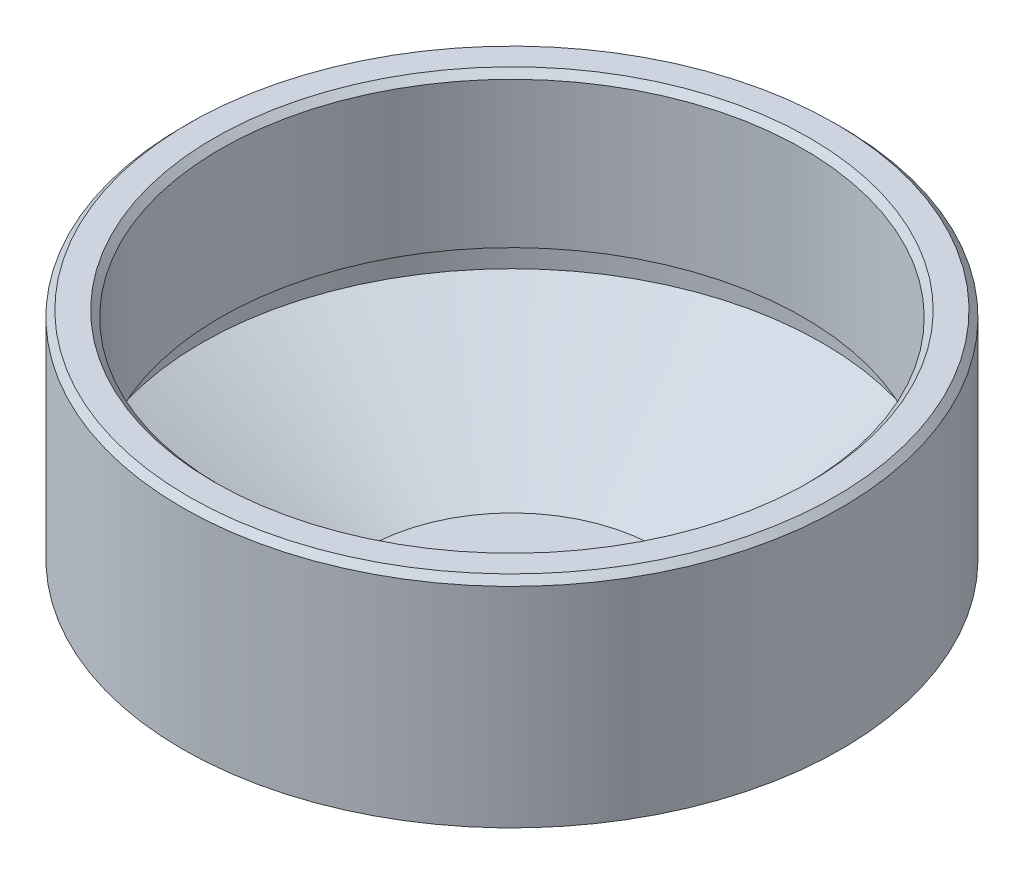
ISO-10303-21;
HEADER;
FILE_DESCRIPTION(('STEP AP214'),'2;1');
FILE_NAME('part.step','',(''),(''),'','','');
FILE_SCHEMA(('AUTOMOTIVE_DESIGN { 1 0 10303 214 1 1 1 1 }'));
ENDSEC;
DATA;
#1=APPLICATION_CONTEXT('core data for automotive mechanical design processes');
#2=APPLICATION_PROTOCOL_DEFINITION('international standard','automotive_design',2000,#1);
#3=PRODUCT_CONTEXT('',#1,'mechanical');
#4=PRODUCT('Part','Part','',(#3));
#5=PRODUCT_RELATED_PRODUCT_CATEGORY('part','',(#4));
#6=PRODUCT_DEFINITION_FORMATION('','',#4);
#7=PRODUCT_DEFINITION_CONTEXT('part definition',#1,'design');
#8=PRODUCT_DEFINITION('design','',#6,#7);
#9=PRODUCT_DEFINITION_SHAPE('','',#8);
#10=(LENGTH_UNIT() NAMED_UNIT(*) SI_UNIT(.MILLI.,.METRE.));
#11=(NAMED_UNIT(*) PLANE_ANGLE_UNIT() SI_UNIT($,.RADIAN.));
#12=(NAMED_UNIT(*) SI_UNIT($,.STERADIAN.) SOLID_ANGLE_UNIT());
#13=UNCERTAINTY_MEASURE_WITH_UNIT(LENGTH_MEASURE(1.E-05),#10,'distance_accuracy_value','');
#14=(GEOMETRIC_REPRESENTATION_CONTEXT(3) GLOBAL_UNCERTAINTY_ASSIGNED_CONTEXT((#13)) GLOBAL_UNIT_ASSIGNED_CONTEXT((#10,
#11,#12)) REPRESENTATION_CONTEXT('',''));
#15=CARTESIAN_POINT('',(0.,0.,0.));
#16=DIRECTION('',(0.,0.,1.));
#17=DIRECTION('',(1.,0.,0.));
#18=AXIS2_PLACEMENT_3D('',#15,#16,#17);
#19=CARTESIAN_POINT('',(23.,28.,-1.60608141586784E-13));
#20=DIRECTION('',(0.,1.,0.));
#21=DIRECTION('',(0.,0.,1.));
#22=AXIS2_PLACEMENT_3D('',#19,#20,#21);
#23=PLANE('',#22);
#24=CARTESIAN_POINT('',(0.,28.,0.));
#25=DIRECTION('',(0.,1.,0.));
#26=DIRECTION('',(0.,0.,1.));
#27=AXIS2_PLACEMENT_3D('',#24,#25,#26);
#28=CIRCLE('',#27,25.5);
#29=CARTESIAN_POINT('',(0.,28.,25.5));
#30=VERTEX_POINT('',#29);
#31=EDGE_CURVE('E45',#30,#30,#28,.T.);
#32=ORIENTED_EDGE('',*,*,#31,.T.);
#33=EDGE_LOOP('',(#32));
#34=FACE_BOUND('',#33,.T.);
#35=CARTESIAN_POINT('',(0.,28.,0.));
#36=DIRECTION('',(0.,1.,0.));
#37=DIRECTION('',(0.,0.,1.));
#38=AXIS2_PLACEMENT_3D('',#35,#36,#37);
#39=CIRCLE('',#38,23.5);
#40=CARTESIAN_POINT('',(0.,28.,23.5));
#41=VERTEX_POINT('',#40);
#42=EDGE_CURVE('E49',#41,#41,#39,.F.);
#43=ORIENTED_EDGE('',*,*,#42,.T.);
#44=EDGE_LOOP('',(#43));
#45=FACE_BOUND('',#44,.T.);
#46=ADVANCED_FACE('F34',(#34,#45),#23,.T.);
#47=CARTESIAN_POINT('',(0.,26.1689859870494,0.));
#48=DIRECTION('',(0.,1.,0.));
#49=DIRECTION('',(0.,0.,1.));
#50=AXIS2_PLACEMENT_3D('',#47,#48,#49);
#51=CYLINDRICAL_SURFACE('',#50,26.);
#52=CARTESIAN_POINT('',(0.,27.5,0.));
#53=DIRECTION('',(0.,1.,0.));
#54=DIRECTION('',(0.,0.,1.));
#55=AXIS2_PLACEMENT_3D('',#52,#53,#54);
#56=CIRCLE('',#55,26.);
#57=CARTESIAN_POINT('',(0.,27.5,26.));
#58=VERTEX_POINT('',#57);
#59=EDGE_CURVE('E41',#58,#58,#56,.F.);
#60=ORIENTED_EDGE('',*,*,#59,.T.);
#61=EDGE_LOOP('',(#60));
#62=FACE_BOUND('',#61,.T.);
#63=CARTESIAN_POINT('',(0.,11.,0.));
#64=DIRECTION('',(0.,1.,0.));
#65=DIRECTION('',(0.,0.,1.));
#66=AXIS2_PLACEMENT_3D('',#63,#64,#65);
#67=CIRCLE('',#66,26.);
#68=CARTESIAN_POINT('',(0.,11.,26.));
#69=VERTEX_POINT('',#68);
#70=EDGE_CURVE('E60',#69,#69,#67,.T.);
#71=ORIENTED_EDGE('',*,*,#70,.T.);
#72=EDGE_LOOP('',(#71));
#73=FACE_BOUND('',#72,.T.);
#74=ADVANCED_FACE('F99',(#62,#73),#51,.T.);
#75=CARTESIAN_POINT('',(0.,11.,0.));
#76=DIRECTION('',(0.,1.,0.));
#77=DIRECTION('',(0.,0.,1.));
#78=AXIS2_PLACEMENT_3D('',#75,#76,#77);
#79=CONICAL_SURFACE('',#78,26.,1.0471975511966);
#80=CARTESIAN_POINT('',(0.,0.,0.));
#81=DIRECTION('',(0.,1.,0.));
#82=DIRECTION('',(0.,0.,1.));
#83=AXIS2_PLACEMENT_3D('',#80,#81,#82);
#84=CIRCLE('',#83,6.94744111674223);
#85=CARTESIAN_POINT('',(0.,0.,6.94744111674223));
#86=VERTEX_POINT('',#85);
#87=EDGE_CURVE('E63',#86,#86,#84,.T.);
#88=CARTESIAN_POINT('',(0.,0.,6.94744111674223));
#89=CARTESIAN_POINT('',(0.,0.114583333333334,7.14590527177616));
#90=CARTESIAN_POINT('',(0.,0.229166666666667,7.3443694268101));
#91=CARTESIAN_POINT('',(0.,0.458333333333334,7.74129773687797));
#92=CARTESIAN_POINT('',(0.,0.572916666666667,7.9397618919119));
#93=CARTESIAN_POINT('',(0.,0.802083333333334,8.33669020197977));
#94=CARTESIAN_POINT('',(0.,0.916666666666668,8.53515435701371));
#95=CARTESIAN_POINT('',(0.,1.14583333333333,8.93208266708158));
#96=CARTESIAN_POINT('',(0.,1.26041666666667,9.13054682211551));
#97=CARTESIAN_POINT('',(0.,1.48958333333333,9.52747513218338));
#98=CARTESIAN_POINT('',(0.,1.60416666666667,9.72593928721732));
#99=CARTESIAN_POINT('',(0.,1.83333333333333,10.1228675972852));
#100=CARTESIAN_POINT('',(0.,1.94791666666667,10.3213317523191));
#101=CARTESIAN_POINT('',(0.,2.17708333333333,10.718260062387));
#102=CARTESIAN_POINT('',(0.,2.29166666666667,10.9167242174209));
#103=CARTESIAN_POINT('',(0.,2.52083333333333,11.3136525274888));
#104=CARTESIAN_POINT('',(0.,2.63541666666667,11.5121166825227));
#105=CARTESIAN_POINT('',(0.,2.86458333333333,11.9090449925906));
#106=CARTESIAN_POINT('',(0.,2.97916666666667,12.1075091476245));
#107=CARTESIAN_POINT('',(0.,3.20833333333333,12.5044374576924));
#108=CARTESIAN_POINT('',(0.,3.32291666666667,12.7029016127263));
#109=CARTESIAN_POINT('',(0.,3.55208333333333,13.0998299227942));
#110=CARTESIAN_POINT('',(0.,3.66666666666667,13.2982940778281));
#111=CARTESIAN_POINT('',(0.,3.89583333333333,13.695222387896));
#112=CARTESIAN_POINT('',(0.,4.01041666666667,13.89368654293));
#113=CARTESIAN_POINT('',(0.,4.23958333333333,14.2906148529978));
#114=CARTESIAN_POINT('',(0.,4.35416666666667,14.4890790080318));
#115=CARTESIAN_POINT('',(0.,4.58333333333333,14.8860073180996));
#116=CARTESIAN_POINT('',(0.,4.69791666666667,15.0844714731336));
#117=CARTESIAN_POINT('',(0.,4.92708333333333,15.4813997832014));
#118=CARTESIAN_POINT('',(0.,5.04166666666667,15.6798639382354));
#119=CARTESIAN_POINT('',(0.,5.27083333333333,16.0767922483032));
#120=CARTESIAN_POINT('',(0.,5.38541666666667,16.2752564033372));
#121=CARTESIAN_POINT('',(0.,5.61458333333333,16.672184713405));
#122=CARTESIAN_POINT('',(0.,5.72916666666667,16.870648868439));
#123=CARTESIAN_POINT('',(0.,5.95833333333333,17.2675771785069));
#124=CARTESIAN_POINT('',(0.,6.07291666666667,17.4660413335408));
#125=CARTESIAN_POINT('',(0.,6.30208333333333,17.8629696436087));
#126=CARTESIAN_POINT('',(0.,6.41666666666667,18.0614337986426));
#127=CARTESIAN_POINT('',(0.,6.64583333333333,18.4583621087105));
#128=CARTESIAN_POINT('',(0.,6.76041666666667,18.6568262637444));
#129=CARTESIAN_POINT('',(0.,6.98958333333333,19.0537545738123));
#130=CARTESIAN_POINT('',(0.,7.10416666666667,19.2522187288462));
#131=CARTESIAN_POINT('',(0.,7.33333333333333,19.6491470389141));
#132=CARTESIAN_POINT('',(0.,7.44791666666667,19.847611193948));
#133=CARTESIAN_POINT('',(0.,7.67708333333333,20.2445395040159));
#134=CARTESIAN_POINT('',(0.,7.79166666666667,20.4430036590498));
#135=CARTESIAN_POINT('',(0.,8.02083333333333,20.8399319691177));
#136=CARTESIAN_POINT('',(0.,8.13541666666667,21.0383961241516));
#137=CARTESIAN_POINT('',(0.,8.36458333333333,21.4353244342195));
#138=CARTESIAN_POINT('',(0.,8.47916666666667,21.6337885892534));
#139=CARTESIAN_POINT('',(0.,8.70833333333333,22.0307168993213));
#140=CARTESIAN_POINT('',(0.,8.82291666666667,22.2291810543552));
#141=CARTESIAN_POINT('',(0.,9.05208333333333,22.6261093644231));
#142=CARTESIAN_POINT('',(0.,9.16666666666667,22.824573519457));
#143=CARTESIAN_POINT('',(0.,9.39583333333333,23.2215018295249));
#144=CARTESIAN_POINT('',(0.,9.51041666666667,23.4199659845588));
#145=CARTESIAN_POINT('',(0.,9.73958333333333,23.8168942946267));
#146=CARTESIAN_POINT('',(0.,9.85416666666667,24.0153584496606));
#147=CARTESIAN_POINT('',(0.,10.0833333333333,24.4122867597285));
#148=CARTESIAN_POINT('',(0.,10.1979166666667,24.6107509147625));
#149=CARTESIAN_POINT('',(0.,10.4270833333333,25.0076792248303));
#150=CARTESIAN_POINT('',(0.,10.5416666666667,25.2061433798643));
#151=CARTESIAN_POINT('',(0.,10.7708333333333,25.6030716899321));
#152=CARTESIAN_POINT('',(0.,10.8854166666667,25.8015358449661));
#153=CARTESIAN_POINT('',(0.,11.,26.));
#154=B_SPLINE_CURVE_WITH_KNOTS('',3,(#88,#89,#90,#91,#92,#93,#94,#95,#96,#97,#98,#99,#100,#101,
#102,#103,#104,#105,#106,#107,#108,#109,#110,#111,#112,#113,#114,#115,#116,#117,#118,#119,#120,
#121,#122,#123,#124,#125,#126,#127,#128,#129,#130,#131,#132,#133,#134,#135,#136,#137,#138,#139,
#140,#141,#142,#143,#144,#145,#146,#147,#148,#149,#150,#151,#152,#153),.UNSPECIFIED.,.F.,.F.,(4,
2,2,2,2,2,2,2,2,2,2,2,2,2,2,2,2,2,2,2,2,2,2,2,2,2,2,2,2,2,2,2,4),(0.,0.687500000000003,
1.37500000000001,2.06250000000001,2.75000000000001,3.43750000000002,4.12500000000002,
4.81250000000002,5.50000000000002,6.18750000000003,6.87500000000003,7.56250000000004,
8.25000000000004,8.93750000000004,9.62500000000005,10.3125000000001,11.0000000000001,
11.6875000000001,12.3750000000001,13.0625000000001,13.7500000000001,14.4375000000001,
15.1250000000001,15.8125000000001,16.5000000000001,17.1875000000001,17.8750000000001,
18.5625000000001,19.2500000000001,19.9375000000001,20.6250000000001,21.3125000000001,
22.0000000000001),.UNSPECIFIED.);
#155=EDGE_CURVE('BSEAM105',#86,#69,#154,.T.);
#156=ORIENTED_EDGE('',*,*,#87,.T.);
#157=ORIENTED_EDGE('',*,*,#70,.F.);
#158=ORIENTED_EDGE('',*,*,#155,.T.);
#159=ORIENTED_EDGE('',*,*,#155,.F.);
#160=EDGE_LOOP('',(#156,#158,#157,#159));
#161=FACE_BOUND('',#160,.T.);
#162=ADVANCED_FACE('F105',(#161),#79,.T.);
#163=CARTESIAN_POINT('',(6.94744111674223,0.,0.));
#164=DIRECTION('',(0.,-1.,0.));
#165=DIRECTION('',(0.,0.,-1.));
#166=AXIS2_PLACEMENT_3D('',#163,#164,#165);
#167=PLANE('',#166);
#168=CARTESIAN_POINT('',(0.,0.,0.));
#169=DIRECTION('',(0.,-1.,0.));
#170=DIRECTION('',(0.,0.,-1.));
#171=AXIS2_PLACEMENT_3D('',#168,#169,#170);
#172=CIRCLE('',#171,3.49999999999999);
#173=CARTESIAN_POINT('',(0.,0.,-3.49999999999999));
#174=VERTEX_POINT('',#173);
#175=EDGE_CURVE('E57',#174,#174,#172,.F.);
#176=ORIENTED_EDGE('',*,*,#175,.T.);
#177=EDGE_LOOP('',(#176));
#178=FACE_BOUND('',#177,.T.);
#179=ORIENTED_EDGE('',*,*,#87,.F.);
#180=EDGE_LOOP('',(#179));
#181=FACE_BOUND('',#180,.T.);
#182=ADVANCED_FACE('F150',(#178,#181),#167,.T.);
#183=CARTESIAN_POINT('',(0.,26.1689859870494,0.));
#184=DIRECTION('',(0.,1.,0.));
#185=DIRECTION('',(0.,0.,1.));
#186=AXIS2_PLACEMENT_3D('',#183,#184,#185);
#187=CYLINDRICAL_SURFACE('',#186,3.);
#188=CARTESIAN_POINT('',(0.,0.499999999999997,0.));
#189=DIRECTION('',(0.,-1.,0.));
#190=DIRECTION('',(0.,0.,-1.));
#191=AXIS2_PLACEMENT_3D('',#188,#189,#190);
#192=CIRCLE('',#191,3.);
#193=CARTESIAN_POINT('',(0.,0.499999999999997,-3.));
#194=VERTEX_POINT('',#193);
#195=EDGE_CURVE('E54',#194,#194,#192,.T.);
#196=ORIENTED_EDGE('',*,*,#195,.T.);
#197=EDGE_LOOP('',(#196));
#198=FACE_BOUND('',#197,.T.);
#199=CARTESIAN_POINT('',(0.,6.,0.));
#200=DIRECTION('',(0.,1.,0.));
#201=DIRECTION('',(0.,0.,1.));
#202=AXIS2_PLACEMENT_3D('',#199,#200,#201);
#203=CIRCLE('',#202,3.);
#204=CARTESIAN_POINT('',(0.,6.,3.));
#205=VERTEX_POINT('',#204);
#206=EDGE_CURVE('E66',#205,#205,#203,.T.);
#207=ORIENTED_EDGE('',*,*,#206,.T.);
#208=EDGE_LOOP('',(#207));
#209=FACE_BOUND('',#208,.T.);
#210=ADVANCED_FACE('F144',(#198,#209),#187,.F.);
#211=CARTESIAN_POINT('',(3.,6.,0.));
#212=DIRECTION('',(0.,1.,0.));
#213=DIRECTION('',(0.,0.,1.));
#214=AXIS2_PLACEMENT_3D('',#211,#212,#213);
#215=PLANE('',#214);
#216=CARTESIAN_POINT('',(0.,6.,0.));
#217=DIRECTION('',(0.,1.,0.));
#218=DIRECTION('',(0.,0.,1.));
#219=AXIS2_PLACEMENT_3D('',#216,#217,#218);
#220=CIRCLE('',#219,11.5096189432333);
#221=CARTESIAN_POINT('',(0.,6.,11.5096189432333));
#222=VERTEX_POINT('',#221);
#223=EDGE_CURVE('E69',#222,#222,#220,.T.);
#224=ORIENTED_EDGE('',*,*,#223,.T.);
#225=EDGE_LOOP('',(#224));
#226=FACE_BOUND('',#225,.T.);
#227=ORIENTED_EDGE('',*,*,#206,.F.);
#228=EDGE_LOOP('',(#227));
#229=FACE_BOUND('',#228,.T.);
#230=ADVANCED_FACE('F149',(#226,#229),#215,.T.);
#231=CARTESIAN_POINT('',(0.,6.,0.));
#232=DIRECTION('',(0.,1.,0.));
#233=DIRECTION('',(0.,0.,1.));
#234=AXIS2_PLACEMENT_3D('',#231,#232,#233);
#235=CONICAL_SURFACE('',#234,11.5096189432333,1.0471975511966);
#236=CARTESIAN_POINT('',(0.,13.5,0.));
#237=DIRECTION('',(0.,1.,0.));
#238=DIRECTION('',(0.,0.,1.));
#239=AXIS2_PLACEMENT_3D('',#236,#237,#238);
#240=CIRCLE('',#239,24.5);
#241=CARTESIAN_POINT('',(0.,13.5,24.5));
#242=VERTEX_POINT('',#241);
#243=EDGE_CURVE('E72',#242,#242,#240,.T.);
#244=ORIENTED_EDGE('',*,*,#243,.T.);
#245=EDGE_LOOP('',(#244));
#246=FACE_BOUND('',#245,.T.);
#247=ORIENTED_EDGE('',*,*,#223,.F.);
#248=EDGE_LOOP('',(#247));
#249=FACE_BOUND('',#248,.T.);
#250=ADVANCED_FACE('F187',(#246,#249),#235,.F.);
#251=CARTESIAN_POINT('',(0.,26.1689859870494,0.));
#252=DIRECTION('',(0.,1.,0.));
#253=DIRECTION('',(0.,0.,1.));
#254=AXIS2_PLACEMENT_3D('',#251,#252,#253);
#255=CYLINDRICAL_SURFACE('',#254,24.5);
#256=CARTESIAN_POINT('',(0.,16.,0.));
#257=DIRECTION('',(0.,1.,0.));
#258=DIRECTION('',(0.,0.,1.));
#259=AXIS2_PLACEMENT_3D('',#256,#257,#258);
#260=CIRCLE('',#259,24.5);
#261=CARTESIAN_POINT('',(0.,16.,24.5));
#262=VERTEX_POINT('',#261);
#263=EDGE_CURVE('E75',#262,#262,#260,.T.);
#264=ORIENTED_EDGE('',*,*,#263,.T.);
#265=EDGE_LOOP('',(#264));
#266=FACE_BOUND('',#265,.T.);
#267=ORIENTED_EDGE('',*,*,#243,.F.);
#268=EDGE_LOOP('',(#267));
#269=FACE_BOUND('',#268,.T.);
#270=ADVANCED_FACE('F96',(#266,#269),#255,.F.);
#271=CARTESIAN_POINT('',(24.5,16.,-1.71082585603314E-13));
#272=DIRECTION('',(0.,-1.,0.));
#273=DIRECTION('',(0.,0.,-1.));
#274=AXIS2_PLACEMENT_3D('',#271,#272,#273);
#275=PLANE('',#274);
#276=CARTESIAN_POINT('',(0.,16.,0.));
#277=DIRECTION('',(0.,1.,0.));
#278=DIRECTION('',(0.,0.,1.));
#279=AXIS2_PLACEMENT_3D('',#276,#277,#278);
#280=CIRCLE('',#279,23.);
#281=CARTESIAN_POINT('',(0.,16.,23.));
#282=VERTEX_POINT('',#281);
#283=EDGE_CURVE('E78',#282,#282,#280,.T.);
#284=ORIENTED_EDGE('',*,*,#283,.T.);
#285=EDGE_LOOP('',(#284));
#286=FACE_BOUND('',#285,.T.);
#287=ORIENTED_EDGE('',*,*,#263,.F.);
#288=EDGE_LOOP('',(#287));
#289=FACE_BOUND('',#288,.T.);
#290=ADVANCED_FACE('F82',(#286,#289),#275,.T.);
#291=CARTESIAN_POINT('',(0.,26.1689859870494,0.));
#292=DIRECTION('',(0.,1.,0.));
#293=DIRECTION('',(0.,0.,1.));
#294=AXIS2_PLACEMENT_3D('',#291,#292,#293);
#295=CYLINDRICAL_SURFACE('',#294,23.);
#296=CARTESIAN_POINT('',(0.,27.5,0.));
#297=DIRECTION('',(0.,1.,0.));
#298=DIRECTION('',(0.,0.,1.));
#299=AXIS2_PLACEMENT_3D('',#296,#297,#298);
#300=CIRCLE('',#299,23.);
#301=CARTESIAN_POINT('',(0.,27.5,23.));
#302=VERTEX_POINT('',#301);
#303=EDGE_CURVE('E10',#302,#302,#300,.T.);
#304=ORIENTED_EDGE('',*,*,#303,.T.);
#305=EDGE_LOOP('',(#304));
#306=FACE_BOUND('',#305,.T.);
#307=ORIENTED_EDGE('',*,*,#283,.F.);
#308=EDGE_LOOP('',(#307));
#309=FACE_BOUND('',#308,.T.);
#310=ADVANCED_FACE('F85',(#306,#309),#295,.F.);
#311=CARTESIAN_POINT('',(0.,0.,0.));
#312=DIRECTION('',(0.,-1.,0.));
#313=DIRECTION('',(0.,0.,-1.));
#314=AXIS2_PLACEMENT_3D('',#311,#312,#313);
#315=CONICAL_SURFACE('',#314,3.49999999999999,0.785398163397444);
#316=ORIENTED_EDGE('',*,*,#195,.F.);
#317=EDGE_LOOP('',(#316));
#318=FACE_BOUND('',#317,.T.);
#319=ORIENTED_EDGE('',*,*,#175,.F.);
#320=EDGE_LOOP('',(#319));
#321=FACE_BOUND('',#320,.T.);
#322=ADVANCED_FACE('F87',(#318,#321),#315,.F.);
#323=CARTESIAN_POINT('',(0.,28.,0.));
#324=DIRECTION('',(0.,-1.,0.));
#325=DIRECTION('',(0.,0.,-1.));
#326=AXIS2_PLACEMENT_3D('',#323,#324,#325);
#327=CONICAL_SURFACE('',#326,25.5,0.785398163397441);
#328=ORIENTED_EDGE('',*,*,#59,.F.);
#329=EDGE_LOOP('',(#328));
#330=FACE_BOUND('',#329,.T.);
#331=ORIENTED_EDGE('',*,*,#31,.F.);
#332=EDGE_LOOP('',(#331));
#333=FACE_BOUND('',#332,.T.);
#334=ADVANCED_FACE('F93',(#330,#333),#327,.T.);
#335=CARTESIAN_POINT('',(0.,27.5,0.));
#336=DIRECTION('',(0.,1.,0.));
#337=DIRECTION('',(0.,0.,1.));
#338=AXIS2_PLACEMENT_3D('',#335,#336,#337);
#339=CONICAL_SURFACE('',#338,23.,0.785398163397452);
#340=ORIENTED_EDGE('',*,*,#42,.F.);
#341=EDGE_LOOP('',(#340));
#342=FACE_BOUND('',#341,.T.);
#343=ORIENTED_EDGE('',*,*,#303,.F.);
#344=EDGE_LOOP('',(#343));
#345=FACE_BOUND('',#344,.T.);
#346=ADVANCED_FACE('F36',(#342,#345),#339,.F.);
#347=CLOSED_SHELL('',(#46,#74,#162,#182,#210,#230,#250,#270,#290,#310,#322,#334,#346));
#348=MANIFOLD_SOLID_BREP('B2',#347);
#349=ADVANCED_BREP_SHAPE_REPRESENTATION('',(#18,#348),#14);
#350=SHAPE_DEFINITION_REPRESENTATION(#9,#349);
ENDSEC;
END-ISO-10303-21;
